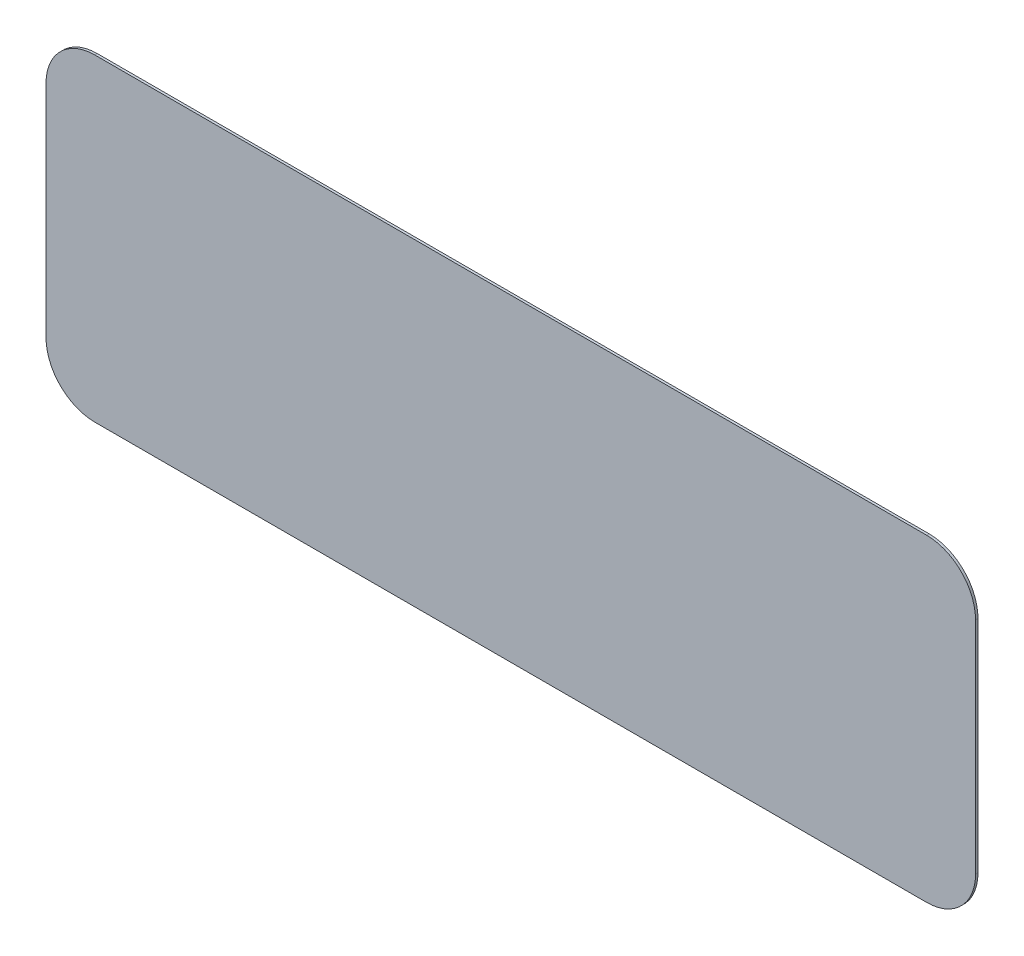
ISO-10303-21;
HEADER;
FILE_DESCRIPTION(('STEP AP214'),'2;1');
FILE_NAME('part.step','',(''),(''),'','','');
FILE_SCHEMA(('AUTOMOTIVE_DESIGN { 1 0 10303 214 1 1 1 1 }'));
ENDSEC;
DATA;
#1=APPLICATION_CONTEXT('core data for automotive mechanical design processes');
#2=APPLICATION_PROTOCOL_DEFINITION('international standard','automotive_design',2000,#1);
#3=PRODUCT_CONTEXT('',#1,'mechanical');
#4=PRODUCT('Part','Part','',(#3));
#5=PRODUCT_RELATED_PRODUCT_CATEGORY('part','',(#4));
#6=PRODUCT_DEFINITION_FORMATION('','',#4);
#7=PRODUCT_DEFINITION_CONTEXT('part definition',#1,'design');
#8=PRODUCT_DEFINITION('design','',#6,#7);
#9=PRODUCT_DEFINITION_SHAPE('','',#8);
#10=(LENGTH_UNIT() NAMED_UNIT(*) SI_UNIT(.MILLI.,.METRE.));
#11=(NAMED_UNIT(*) PLANE_ANGLE_UNIT() SI_UNIT($,.RADIAN.));
#12=(NAMED_UNIT(*) SI_UNIT($,.STERADIAN.) SOLID_ANGLE_UNIT());
#13=UNCERTAINTY_MEASURE_WITH_UNIT(LENGTH_MEASURE(1.E-05),#10,'distance_accuracy_value','');
#14=(GEOMETRIC_REPRESENTATION_CONTEXT(3) GLOBAL_UNCERTAINTY_ASSIGNED_CONTEXT((#13)) GLOBAL_UNIT_ASSIGNED_CONTEXT((#10,
#11,#12)) REPRESENTATION_CONTEXT('',''));
#15=CARTESIAN_POINT('',(0.,0.,0.));
#16=DIRECTION('',(0.,0.,1.));
#17=DIRECTION('',(1.,0.,0.));
#18=AXIS2_PLACEMENT_3D('',#15,#16,#17);
#19=CARTESIAN_POINT('',(-19.,-17.,2.5));
#20=DIRECTION('',(1.,0.,0.));
#21=DIRECTION('',(0.,1.,0.));
#22=AXIS2_PLACEMENT_3D('',#19,#20,#21);
#23=PLANE('',#22);
#24=DIRECTION('',(0.,-1.,0.));
#25=VECTOR('',#24,1.);
#26=CARTESIAN_POINT('',(-19.,-17.,2.4));
#27=LINE('',#26,#25);
#28=CARTESIAN_POINT('',(-19.,-17.,2.4));
#29=VERTEX_POINT('',#28);
#30=CARTESIAN_POINT('',(-19.,-26.,2.4));
#31=VERTEX_POINT('',#30);
#32=EDGE_CURVE('E11',#29,#31,#27,.T.);
#33=ORIENTED_EDGE('',*,*,#32,.T.);
#34=DIRECTION('',(0.,0.,-1.));
#35=VECTOR('',#34,1.);
#36=CARTESIAN_POINT('',(-19.,-26.,2.5));
#37=LINE('',#36,#35);
#38=CARTESIAN_POINT('',(-19.,-26.,2.5));
#39=VERTEX_POINT('',#38);
#40=EDGE_CURVE('E41',#39,#31,#37,.T.);
#41=ORIENTED_EDGE('',*,*,#40,.F.);
#42=DIRECTION('',(0.,-1.,0.));
#43=VECTOR('',#42,1.);
#44=CARTESIAN_POINT('',(-19.,-17.,2.5));
#45=LINE('',#44,#43);
#46=CARTESIAN_POINT('',(-19.,-17.,2.5));
#47=VERTEX_POINT('',#46);
#48=EDGE_CURVE('E51',#47,#39,#45,.T.);
#49=ORIENTED_EDGE('',*,*,#48,.F.);
#50=DIRECTION('',(0.,0.,-1.));
#51=VECTOR('',#50,1.);
#52=CARTESIAN_POINT('',(-19.,-17.,2.5));
#53=LINE('',#52,#51);
#54=EDGE_CURVE('E27',#47,#29,#53,.T.);
#55=ORIENTED_EDGE('',*,*,#54,.T.);
#56=EDGE_LOOP('',(#33,#41,#49,#55));
#57=FACE_BOUND('',#56,.T.);
#58=ADVANCED_FACE('F17',(#57),#23,.F.);
#59=CARTESIAN_POINT('',(-17.,-26.,2.5));
#60=DIRECTION('',(0.,0.,-1.));
#61=DIRECTION('',(-1.,0.,0.));
#62=AXIS2_PLACEMENT_3D('',#59,#60,#61);
#63=CYLINDRICAL_SURFACE('',#62,2.);
#64=CARTESIAN_POINT('',(-17.,-26.,2.4));
#65=DIRECTION('',(0.,0.,1.));
#66=DIRECTION('',(1.,0.,0.));
#67=AXIS2_PLACEMENT_3D('',#64,#65,#66);
#68=CIRCLE('',#67,2.);
#69=CARTESIAN_POINT('',(-17.,-28.,2.4));
#70=VERTEX_POINT('',#69);
#71=EDGE_CURVE('E118',#31,#70,#68,.T.);
#72=ORIENTED_EDGE('',*,*,#71,.T.);
#73=DIRECTION('',(0.,0.,-1.));
#74=VECTOR('',#73,1.);
#75=CARTESIAN_POINT('',(-17.,-28.,2.5));
#76=LINE('',#75,#74);
#77=CARTESIAN_POINT('',(-17.,-28.,2.5));
#78=VERTEX_POINT('',#77);
#79=EDGE_CURVE('E115',#78,#70,#76,.T.);
#80=ORIENTED_EDGE('',*,*,#79,.F.);
#81=CARTESIAN_POINT('',(-17.,-26.,2.5));
#82=DIRECTION('',(0.,0.,1.));
#83=DIRECTION('',(1.,0.,0.));
#84=AXIS2_PLACEMENT_3D('',#81,#82,#83);
#85=CIRCLE('',#84,2.);
#86=EDGE_CURVE('E107',#39,#78,#85,.T.);
#87=ORIENTED_EDGE('',*,*,#86,.F.);
#88=ORIENTED_EDGE('',*,*,#40,.T.);
#89=EDGE_LOOP('',(#72,#80,#87,#88));
#90=FACE_BOUND('',#89,.T.);
#91=ADVANCED_FACE('F116',(#90),#63,.T.);
#92=CARTESIAN_POINT('',(-17.,-28.,2.5));
#93=DIRECTION('',(0.,1.,0.));
#94=DIRECTION('',(1.,0.,0.));
#95=AXIS2_PLACEMENT_3D('',#92,#93,#94);
#96=PLANE('',#95);
#97=DIRECTION('',(1.,0.,0.));
#98=VECTOR('',#97,1.);
#99=CARTESIAN_POINT('',(-17.,-28.,2.4));
#100=LINE('',#99,#98);
#101=CARTESIAN_POINT('',(17.,-28.,2.4));
#102=VERTEX_POINT('',#101);
#103=EDGE_CURVE('E123',#70,#102,#100,.T.);
#104=ORIENTED_EDGE('',*,*,#103,.T.);
#105=DIRECTION('',(0.,0.,-1.));
#106=VECTOR('',#105,1.);
#107=CARTESIAN_POINT('',(17.,-28.,2.5));
#108=LINE('',#107,#106);
#109=CARTESIAN_POINT('',(17.,-28.,2.5));
#110=VERTEX_POINT('',#109);
#111=EDGE_CURVE('E127',#110,#102,#108,.T.);
#112=ORIENTED_EDGE('',*,*,#111,.F.);
#113=DIRECTION('',(1.,0.,0.));
#114=VECTOR('',#113,1.);
#115=CARTESIAN_POINT('',(-17.,-28.,2.5));
#116=LINE('',#115,#114);
#117=EDGE_CURVE('E111',#78,#110,#116,.T.);
#118=ORIENTED_EDGE('',*,*,#117,.F.);
#119=ORIENTED_EDGE('',*,*,#79,.T.);
#120=EDGE_LOOP('',(#104,#112,#118,#119));
#121=FACE_BOUND('',#120,.T.);
#122=ADVANCED_FACE('F126',(#121),#96,.F.);
#123=CARTESIAN_POINT('',(17.,-26.,2.5));
#124=DIRECTION('',(0.,0.,-1.));
#125=DIRECTION('',(-1.,0.,0.));
#126=AXIS2_PLACEMENT_3D('',#123,#124,#125);
#127=CYLINDRICAL_SURFACE('',#126,2.);
#128=CARTESIAN_POINT('',(17.,-26.,2.4));
#129=DIRECTION('',(0.,0.,1.));
#130=DIRECTION('',(1.,0.,0.));
#131=AXIS2_PLACEMENT_3D('',#128,#129,#130);
#132=CIRCLE('',#131,2.);
#133=CARTESIAN_POINT('',(19.,-26.,2.4));
#134=VERTEX_POINT('',#133);
#135=EDGE_CURVE('E124',#102,#134,#132,.T.);
#136=ORIENTED_EDGE('',*,*,#135,.T.);
#137=DIRECTION('',(0.,0.,-1.));
#138=VECTOR('',#137,1.);
#139=CARTESIAN_POINT('',(19.,-26.,2.5));
#140=LINE('',#139,#138);
#141=CARTESIAN_POINT('',(19.,-26.,2.5));
#142=VERTEX_POINT('',#141);
#143=EDGE_CURVE('E140',#142,#134,#140,.T.);
#144=ORIENTED_EDGE('',*,*,#143,.F.);
#145=CARTESIAN_POINT('',(17.,-26.,2.5));
#146=DIRECTION('',(0.,0.,1.));
#147=DIRECTION('',(1.,0.,0.));
#148=AXIS2_PLACEMENT_3D('',#145,#146,#147);
#149=CIRCLE('',#148,2.);
#150=EDGE_CURVE('E130',#110,#142,#149,.T.);
#151=ORIENTED_EDGE('',*,*,#150,.F.);
#152=ORIENTED_EDGE('',*,*,#111,.T.);
#153=EDGE_LOOP('',(#136,#144,#151,#152));
#154=FACE_BOUND('',#153,.T.);
#155=ADVANCED_FACE('F328',(#154),#127,.T.);
#156=CARTESIAN_POINT('',(19.,-26.,2.5));
#157=DIRECTION('',(-1.,0.,0.));
#158=DIRECTION('',(0.,1.,0.));
#159=AXIS2_PLACEMENT_3D('',#156,#157,#158);
#160=PLANE('',#159);
#161=DIRECTION('',(0.,1.,0.));
#162=VECTOR('',#161,1.);
#163=CARTESIAN_POINT('',(19.,-26.,2.4));
#164=LINE('',#163,#162);
#165=CARTESIAN_POINT('',(19.,-17.,2.4));
#166=VERTEX_POINT('',#165);
#167=EDGE_CURVE('E142',#134,#166,#164,.T.);
#168=ORIENTED_EDGE('',*,*,#167,.T.);
#169=DIRECTION('',(0.,0.,-1.));
#170=VECTOR('',#169,1.);
#171=CARTESIAN_POINT('',(19.,-17.,2.5));
#172=LINE('',#171,#170);
#173=CARTESIAN_POINT('',(19.,-17.,2.5));
#174=VERTEX_POINT('',#173);
#175=EDGE_CURVE('E156',#174,#166,#172,.T.);
#176=ORIENTED_EDGE('',*,*,#175,.F.);
#177=DIRECTION('',(0.,1.,0.));
#178=VECTOR('',#177,1.);
#179=CARTESIAN_POINT('',(19.,-26.,2.5));
#180=LINE('',#179,#178);
#181=EDGE_CURVE('E136',#142,#174,#180,.T.);
#182=ORIENTED_EDGE('',*,*,#181,.F.);
#183=ORIENTED_EDGE('',*,*,#143,.T.);
#184=EDGE_LOOP('',(#168,#176,#182,#183));
#185=FACE_BOUND('',#184,.T.);
#186=ADVANCED_FACE('F324',(#185),#160,.F.);
#187=CARTESIAN_POINT('',(17.,-17.,2.5));
#188=DIRECTION('',(0.,0.,-1.));
#189=DIRECTION('',(-1.,0.,0.));
#190=AXIS2_PLACEMENT_3D('',#187,#188,#189);
#191=CYLINDRICAL_SURFACE('',#190,2.);
#192=CARTESIAN_POINT('',(17.,-17.,2.4));
#193=DIRECTION('',(0.,0.,1.));
#194=DIRECTION('',(1.,0.,0.));
#195=AXIS2_PLACEMENT_3D('',#192,#193,#194);
#196=CIRCLE('',#195,2.);
#197=CARTESIAN_POINT('',(17.,-15.,2.4));
#198=VERTEX_POINT('',#197);
#199=EDGE_CURVE('E143',#166,#198,#196,.T.);
#200=ORIENTED_EDGE('',*,*,#199,.T.);
#201=DIRECTION('',(0.,0.,-1.));
#202=VECTOR('',#201,1.);
#203=CARTESIAN_POINT('',(17.,-15.,2.5));
#204=LINE('',#203,#202);
#205=CARTESIAN_POINT('',(17.,-15.,2.5));
#206=VERTEX_POINT('',#205);
#207=EDGE_CURVE('E150',#206,#198,#204,.T.);
#208=ORIENTED_EDGE('',*,*,#207,.F.);
#209=CARTESIAN_POINT('',(17.,-17.,2.5));
#210=DIRECTION('',(0.,0.,1.));
#211=DIRECTION('',(1.,0.,0.));
#212=AXIS2_PLACEMENT_3D('',#209,#210,#211);
#213=CIRCLE('',#212,2.);
#214=EDGE_CURVE('E159',#174,#206,#213,.T.);
#215=ORIENTED_EDGE('',*,*,#214,.F.);
#216=ORIENTED_EDGE('',*,*,#175,.T.);
#217=EDGE_LOOP('',(#200,#208,#215,#216));
#218=FACE_BOUND('',#217,.T.);
#219=ADVANCED_FACE('F19',(#218),#191,.T.);
#220=CARTESIAN_POINT('',(17.,-15.,2.5));
#221=DIRECTION('',(0.,-1.,0.));
#222=DIRECTION('',(0.,0.,-1.));
#223=AXIS2_PLACEMENT_3D('',#220,#221,#222);
#224=PLANE('',#223);
#225=DIRECTION('',(-1.,0.,0.));
#226=VECTOR('',#225,1.);
#227=CARTESIAN_POINT('',(17.,-15.,2.4));
#228=LINE('',#227,#226);
#229=CARTESIAN_POINT('',(-17.,-15.,2.4));
#230=VERTEX_POINT('',#229);
#231=EDGE_CURVE('E21',#198,#230,#228,.T.);
#232=ORIENTED_EDGE('',*,*,#231,.T.);
#233=DIRECTION('',(0.,0.,-1.));
#234=VECTOR('',#233,1.);
#235=CARTESIAN_POINT('',(-17.,-15.,2.5));
#236=LINE('',#235,#234);
#237=CARTESIAN_POINT('',(-17.,-15.,2.5));
#238=VERTEX_POINT('',#237);
#239=EDGE_CURVE('E147',#238,#230,#236,.T.);
#240=ORIENTED_EDGE('',*,*,#239,.F.);
#241=DIRECTION('',(-1.,0.,0.));
#242=VECTOR('',#241,1.);
#243=CARTESIAN_POINT('',(17.,-15.,2.5));
#244=LINE('',#243,#242);
#245=EDGE_CURVE('E162',#206,#238,#244,.T.);
#246=ORIENTED_EDGE('',*,*,#245,.F.);
#247=ORIENTED_EDGE('',*,*,#207,.T.);
#248=EDGE_LOOP('',(#232,#240,#246,#247));
#249=FACE_BOUND('',#248,.T.);
#250=ADVANCED_FACE('F337',(#249),#224,.F.);
#251=CARTESIAN_POINT('',(-17.,-17.,2.5));
#252=DIRECTION('',(0.,0.,-1.));
#253=DIRECTION('',(-1.,0.,0.));
#254=AXIS2_PLACEMENT_3D('',#251,#252,#253);
#255=CYLINDRICAL_SURFACE('',#254,2.);
#256=CARTESIAN_POINT('',(-17.,-17.,2.4));
#257=DIRECTION('',(0.,0.,1.));
#258=DIRECTION('',(1.,0.,0.));
#259=AXIS2_PLACEMENT_3D('',#256,#257,#258);
#260=CIRCLE('',#259,2.);
#261=EDGE_CURVE('E153',#230,#29,#260,.T.);
#262=ORIENTED_EDGE('',*,*,#261,.T.);
#263=ORIENTED_EDGE('',*,*,#54,.F.);
#264=CARTESIAN_POINT('',(-17.,-17.,2.5));
#265=DIRECTION('',(0.,0.,1.));
#266=DIRECTION('',(1.,0.,0.));
#267=AXIS2_PLACEMENT_3D('',#264,#265,#266);
#268=CIRCLE('',#267,2.);
#269=EDGE_CURVE('E185',#238,#47,#268,.T.);
#270=ORIENTED_EDGE('',*,*,#269,.F.);
#271=ORIENTED_EDGE('',*,*,#239,.T.);
#272=EDGE_LOOP('',(#262,#263,#270,#271));
#273=FACE_BOUND('',#272,.T.);
#274=ADVANCED_FACE('F196',(#273),#255,.T.);
#275=CARTESIAN_POINT('',(-17.,-26.,2.5));
#276=DIRECTION('',(0.,0.,1.));
#277=DIRECTION('',(1.,0.,0.));
#278=AXIS2_PLACEMENT_3D('',#275,#276,#277);
#279=PLANE('',#278);
#280=ORIENTED_EDGE('',*,*,#48,.T.);
#281=ORIENTED_EDGE('',*,*,#86,.T.);
#282=ORIENTED_EDGE('',*,*,#117,.T.);
#283=ORIENTED_EDGE('',*,*,#150,.T.);
#284=ORIENTED_EDGE('',*,*,#181,.T.);
#285=ORIENTED_EDGE('',*,*,#214,.T.);
#286=ORIENTED_EDGE('',*,*,#245,.T.);
#287=ORIENTED_EDGE('',*,*,#269,.T.);
#288=EDGE_LOOP('',(#280,#281,#282,#283,#284,#285,#286,#287));
#289=FACE_BOUND('',#288,.T.);
#290=ADVANCED_FACE('F109',(#289),#279,.T.);
#291=CARTESIAN_POINT('',(-17.,-26.,2.4));
#292=DIRECTION('',(0.,0.,1.));
#293=DIRECTION('',(1.,0.,0.));
#294=AXIS2_PLACEMENT_3D('',#291,#292,#293);
#295=PLANE('',#294);
#296=ORIENTED_EDGE('',*,*,#32,.F.);
#297=ORIENTED_EDGE('',*,*,#261,.F.);
#298=ORIENTED_EDGE('',*,*,#231,.F.);
#299=ORIENTED_EDGE('',*,*,#199,.F.);
#300=ORIENTED_EDGE('',*,*,#167,.F.);
#301=ORIENTED_EDGE('',*,*,#135,.F.);
#302=ORIENTED_EDGE('',*,*,#103,.F.);
#303=ORIENTED_EDGE('',*,*,#71,.F.);
#304=EDGE_LOOP('',(#296,#297,#298,#299,#300,#301,#302,#303));
#305=FACE_BOUND('',#304,.T.);
#306=ADVANCED_FACE('F202',(#305),#295,.F.);
#307=CLOSED_SHELL('',(#58,#91,#122,#155,#186,#219,#250,#274,#290,#306));
#308=MANIFOLD_SOLID_BREP('B1',#307);
#309=ADVANCED_BREP_SHAPE_REPRESENTATION('',(#18,#308),#14);
#310=SHAPE_DEFINITION_REPRESENTATION(#9,#309);
ENDSEC;
END-ISO-10303-21;
